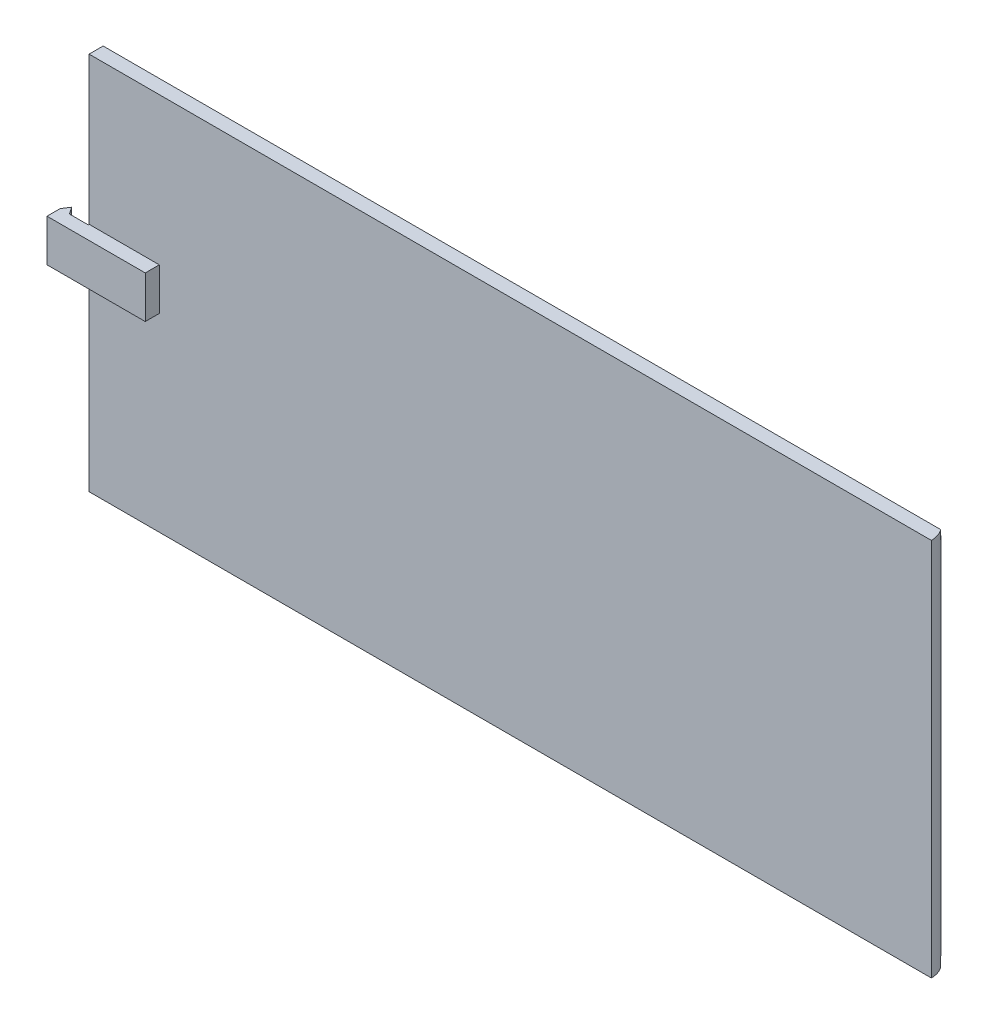
ISO-10303-21;
HEADER;
FILE_DESCRIPTION(('STEP AP214'),'2;1');
FILE_NAME('part.step','',(''),(''),'','','');
FILE_SCHEMA(('AUTOMOTIVE_DESIGN { 1 0 10303 214 1 1 1 1 }'));
ENDSEC;
DATA;
#1=APPLICATION_CONTEXT('core data for automotive mechanical design processes');
#2=APPLICATION_PROTOCOL_DEFINITION('international standard','automotive_design',2000,#1);
#3=PRODUCT_CONTEXT('',#1,'mechanical');
#4=PRODUCT('Part','Part','',(#3));
#5=PRODUCT_RELATED_PRODUCT_CATEGORY('part','',(#4));
#6=PRODUCT_DEFINITION_FORMATION('','',#4);
#7=PRODUCT_DEFINITION_CONTEXT('part definition',#1,'design');
#8=PRODUCT_DEFINITION('design','',#6,#7);
#9=PRODUCT_DEFINITION_SHAPE('','',#8);
#10=(LENGTH_UNIT() NAMED_UNIT(*) SI_UNIT(.MILLI.,.METRE.));
#11=(NAMED_UNIT(*) PLANE_ANGLE_UNIT() SI_UNIT($,.RADIAN.));
#12=(NAMED_UNIT(*) SI_UNIT($,.STERADIAN.) SOLID_ANGLE_UNIT());
#13=UNCERTAINTY_MEASURE_WITH_UNIT(LENGTH_MEASURE(1.E-05),#10,'distance_accuracy_value','');
#14=(GEOMETRIC_REPRESENTATION_CONTEXT(3) GLOBAL_UNCERTAINTY_ASSIGNED_CONTEXT((#13)) GLOBAL_UNIT_ASSIGNED_CONTEXT((#10,
#11,#12)) REPRESENTATION_CONTEXT('',''));
#15=CARTESIAN_POINT('',(0.,0.,0.));
#16=DIRECTION('',(0.,0.,1.));
#17=DIRECTION('',(1.,0.,0.));
#18=AXIS2_PLACEMENT_3D('',#15,#16,#17);
#19=CARTESIAN_POINT('',(-90.,-40.5,5.));
#20=DIRECTION('',(1.,0.,0.));
#21=DIRECTION('',(0.,0.,-1.));
#22=AXIS2_PLACEMENT_3D('',#19,#20,#21);
#23=PLANE('',#22);
#24=DIRECTION('',(0.,-1.,0.));
#25=VECTOR('',#24,1.);
#26=CARTESIAN_POINT('',(-90.,9.,5.2));
#27=LINE('',#26,#25);
#28=CARTESIAN_POINT('',(-90.,9.,5.2));
#29=VERTEX_POINT('',#28);
#30=CARTESIAN_POINT('',(-90.,0.,5.2));
#31=VERTEX_POINT('',#30);
#32=EDGE_CURVE('E289',#29,#31,#27,.T.);
#33=ORIENTED_EDGE('',*,*,#32,.F.);
#34=DIRECTION('',(0.,0.,-1.));
#35=VECTOR('',#34,1.);
#36=CARTESIAN_POINT('',(-90.,9.,8.));
#37=LINE('',#36,#35);
#38=CARTESIAN_POINT('',(-90.,9.,5.));
#39=VERTEX_POINT('',#38);
#40=EDGE_CURVE('E167',#29,#39,#37,.T.);
#41=ORIENTED_EDGE('',*,*,#40,.T.);
#42=DIRECTION('',(0.,-1.,0.));
#43=VECTOR('',#42,1.);
#44=CARTESIAN_POINT('',(-90.,-40.5,5.));
#45=LINE('',#44,#43);
#46=CARTESIAN_POINT('',(-90.,40.5,5.));
#47=VERTEX_POINT('',#46);
#48=EDGE_CURVE('E225',#47,#39,#45,.T.);
#49=ORIENTED_EDGE('',*,*,#48,.F.);
#50=DIRECTION('',(0.,0.,-1.));
#51=VECTOR('',#50,1.);
#52=CARTESIAN_POINT('',(-90.,40.5,5.));
#53=LINE('',#52,#51);
#54=CARTESIAN_POINT('',(-90.,40.5,2.));
#55=VERTEX_POINT('',#54);
#56=EDGE_CURVE('E235',#47,#55,#53,.T.);
#57=ORIENTED_EDGE('',*,*,#56,.T.);
#58=DIRECTION('',(0.,1.,0.));
#59=VECTOR('',#58,1.);
#60=CARTESIAN_POINT('',(-90.,40.5,2.));
#61=LINE('',#60,#59);
#62=CARTESIAN_POINT('',(-90.,38.5,2.));
#63=VERTEX_POINT('',#62);
#64=EDGE_CURVE('E198',#63,#55,#61,.T.);
#65=ORIENTED_EDGE('',*,*,#64,.F.);
#66=DIRECTION('',(0.,0.,1.));
#67=VECTOR('',#66,1.);
#68=CARTESIAN_POINT('',(-90.,38.5,0.));
#69=LINE('',#68,#67);
#70=CARTESIAN_POINT('',(-90.,38.5,0.));
#71=VERTEX_POINT('',#70);
#72=EDGE_CURVE('E195',#71,#63,#69,.T.);
#73=ORIENTED_EDGE('',*,*,#72,.F.);
#74=DIRECTION('',(0.,-1.,0.));
#75=VECTOR('',#74,1.);
#76=CARTESIAN_POINT('',(-90.,-40.5,0.));
#77=LINE('',#76,#75);
#78=CARTESIAN_POINT('',(-90.,-38.5,0.));
#79=VERTEX_POINT('',#78);
#80=EDGE_CURVE('E205',#71,#79,#77,.T.);
#81=ORIENTED_EDGE('',*,*,#80,.T.);
#82=DIRECTION('',(0.,0.,-1.));
#83=VECTOR('',#82,1.);
#84=CARTESIAN_POINT('',(-90.,-38.5,0.));
#85=LINE('',#84,#83);
#86=CARTESIAN_POINT('',(-90.,-38.5,2.));
#87=VERTEX_POINT('',#86);
#88=EDGE_CURVE('E211',#87,#79,#85,.T.);
#89=ORIENTED_EDGE('',*,*,#88,.F.);
#90=DIRECTION('',(0.,1.,0.));
#91=VECTOR('',#90,1.);
#92=CARTESIAN_POINT('',(-90.,-40.5,2.));
#93=LINE('',#92,#91);
#94=CARTESIAN_POINT('',(-90.,-40.5,2.));
#95=VERTEX_POINT('',#94);
#96=EDGE_CURVE('E194',#95,#87,#93,.T.);
#97=ORIENTED_EDGE('',*,*,#96,.F.);
#98=DIRECTION('',(0.,0.,-1.));
#99=VECTOR('',#98,1.);
#100=CARTESIAN_POINT('',(-90.,-40.5,5.));
#101=LINE('',#100,#99);
#102=CARTESIAN_POINT('',(-90.,-40.5,5.));
#103=VERTEX_POINT('',#102);
#104=EDGE_CURVE('E230',#103,#95,#101,.T.);
#105=ORIENTED_EDGE('',*,*,#104,.F.);
#106=CARTESIAN_POINT('',(-90.,0.,5.));
#107=VERTEX_POINT('',#106);
#108=EDGE_CURVE('E224',#107,#103,#45,.T.);
#109=ORIENTED_EDGE('',*,*,#108,.F.);
#110=DIRECTION('',(0.,0.,-1.));
#111=VECTOR('',#110,1.);
#112=CARTESIAN_POINT('',(-90.,0.,8.));
#113=LINE('',#112,#111);
#114=EDGE_CURVE('E192',#31,#107,#113,.T.);
#115=ORIENTED_EDGE('',*,*,#114,.F.);
#116=EDGE_LOOP('',(#33,#41,#49,#57,#65,#73,#81,#89,#97,#105,#109,#115));
#117=FACE_BOUND('',#116,.T.);
#118=ADVANCED_FACE('F34',(#117),#23,.F.);
#119=CARTESIAN_POINT('',(0.,0.,5.));
#120=DIRECTION('',(0.,0.,-1.));
#121=DIRECTION('',(-1.,0.,0.));
#122=AXIS2_PLACEMENT_3D('',#119,#120,#121);
#123=PLANE('',#122);
#124=DIRECTION('',(-1.,0.,0.));
#125=VECTOR('',#124,1.);
#126=CARTESIAN_POINT('',(-90.,9.,5.));
#127=LINE('',#126,#125);
#128=CARTESIAN_POINT('',(-75.,9.,5.));
#129=VERTEX_POINT('',#128);
#130=EDGE_CURVE('E57',#129,#39,#127,.T.);
#131=ORIENTED_EDGE('',*,*,#130,.F.);
#132=DIRECTION('',(0.,1.,0.));
#133=VECTOR('',#132,1.);
#134=CARTESIAN_POINT('',(-75.,0.,5.));
#135=LINE('',#134,#133);
#136=CARTESIAN_POINT('',(-75.,0.,5.));
#137=VERTEX_POINT('',#136);
#138=EDGE_CURVE('E171',#137,#129,#135,.T.);
#139=ORIENTED_EDGE('',*,*,#138,.F.);
#140=DIRECTION('',(1.,0.,0.));
#141=VECTOR('',#140,1.);
#142=CARTESIAN_POINT('',(-90.,0.,5.));
#143=LINE('',#142,#141);
#144=EDGE_CURVE('E168',#107,#137,#143,.T.);
#145=ORIENTED_EDGE('',*,*,#144,.F.);
#146=ORIENTED_EDGE('',*,*,#108,.T.);
#147=DIRECTION('',(1.,0.,0.));
#148=VECTOR('',#147,1.);
#149=CARTESIAN_POINT('',(-90.,-40.5,5.));
#150=LINE('',#149,#148);
#151=CARTESIAN_POINT('',(90.,-40.5,5.));
#152=VERTEX_POINT('',#151);
#153=EDGE_CURVE('E227',#103,#152,#150,.T.);
#154=ORIENTED_EDGE('',*,*,#153,.T.);
#155=DIRECTION('',(0.,1.,0.));
#156=VECTOR('',#155,1.);
#157=CARTESIAN_POINT('',(90.,-40.5,5.));
#158=LINE('',#157,#156);
#159=CARTESIAN_POINT('',(90.,40.5,5.));
#160=VERTEX_POINT('',#159);
#161=EDGE_CURVE('E219',#152,#160,#158,.T.);
#162=ORIENTED_EDGE('',*,*,#161,.T.);
#163=DIRECTION('',(-1.,0.,0.));
#164=VECTOR('',#163,1.);
#165=CARTESIAN_POINT('',(-90.,40.5,5.));
#166=LINE('',#165,#164);
#167=EDGE_CURVE('E222',#160,#47,#166,.T.);
#168=ORIENTED_EDGE('',*,*,#167,.T.);
#169=ORIENTED_EDGE('',*,*,#48,.T.);
#170=EDGE_LOOP('',(#131,#139,#145,#146,#154,#162,#168,#169));
#171=FACE_BOUND('',#170,.T.);
#172=ADVANCED_FACE('F278',(#171),#123,.F.);
#173=CARTESIAN_POINT('',(-90.,40.5,5.));
#174=DIRECTION('',(0.,-1.,0.));
#175=DIRECTION('',(0.,0.,-1.));
#176=AXIS2_PLACEMENT_3D('',#173,#174,#175);
#177=PLANE('',#176);
#178=CARTESIAN_POINT('',(85.,40.5,5.));
#179=DIRECTION('',(0.,-1.,0.));
#180=DIRECTION('',(0.,0.,-1.));
#181=AXIS2_PLACEMENT_3D('',#178,#179,#180);
#182=CIRCLE('',#181,5.);
#183=CARTESIAN_POINT('',(89.,40.5,2.));
#184=VERTEX_POINT('',#183);
#185=EDGE_CURVE('E238',#160,#184,#182,.F.);
#186=ORIENTED_EDGE('',*,*,#185,.T.);
#187=DIRECTION('',(-1.,0.,0.));
#188=VECTOR('',#187,1.);
#189=CARTESIAN_POINT('',(90.,40.5,2.));
#190=LINE('',#189,#188);
#191=EDGE_CURVE('E202',#184,#55,#190,.T.);
#192=ORIENTED_EDGE('',*,*,#191,.T.);
#193=ORIENTED_EDGE('',*,*,#56,.F.);
#194=ORIENTED_EDGE('',*,*,#167,.F.);
#195=EDGE_LOOP('',(#186,#192,#193,#194));
#196=FACE_BOUND('',#195,.T.);
#197=ADVANCED_FACE('F275',(#196),#177,.F.);
#198=CARTESIAN_POINT('',(-90.,-40.5,5.));
#199=DIRECTION('',(0.,1.,0.));
#200=DIRECTION('',(0.,0.,1.));
#201=AXIS2_PLACEMENT_3D('',#198,#199,#200);
#202=PLANE('',#201);
#203=ORIENTED_EDGE('',*,*,#104,.T.);
#204=DIRECTION('',(-1.,0.,0.));
#205=VECTOR('',#204,1.);
#206=CARTESIAN_POINT('',(90.,-40.5,2.));
#207=LINE('',#206,#205);
#208=CARTESIAN_POINT('',(89.,-40.5,2.));
#209=VERTEX_POINT('',#208);
#210=EDGE_CURVE('E213',#209,#95,#207,.T.);
#211=ORIENTED_EDGE('',*,*,#210,.F.);
#212=CARTESIAN_POINT('',(85.,-40.5,5.));
#213=DIRECTION('',(0.,1.,0.));
#214=DIRECTION('',(0.,0.,1.));
#215=AXIS2_PLACEMENT_3D('',#212,#213,#214);
#216=CIRCLE('',#215,5.);
#217=EDGE_CURVE('E244',#209,#152,#216,.F.);
#218=ORIENTED_EDGE('',*,*,#217,.T.);
#219=ORIENTED_EDGE('',*,*,#153,.F.);
#220=EDGE_LOOP('',(#203,#211,#218,#219));
#221=FACE_BOUND('',#220,.T.);
#222=ADVANCED_FACE('F284',(#221),#202,.F.);
#223=CARTESIAN_POINT('',(0.,0.,0.));
#224=DIRECTION('',(0.,0.,-1.));
#225=DIRECTION('',(-1.,0.,0.));
#226=AXIS2_PLACEMENT_3D('',#223,#224,#225);
#227=PLANE('',#226);
#228=DIRECTION('',(-1.,0.,0.));
#229=VECTOR('',#228,1.);
#230=CARTESIAN_POINT('',(90.,38.5,0.));
#231=LINE('',#230,#229);
#232=CARTESIAN_POINT('',(85.,38.5,0.));
#233=VERTEX_POINT('',#232);
#234=EDGE_CURVE('E201',#233,#71,#231,.T.);
#235=ORIENTED_EDGE('',*,*,#234,.F.);
#236=DIRECTION('',(0.,1.,0.));
#237=VECTOR('',#236,1.);
#238=CARTESIAN_POINT('',(85.,-40.5,0.));
#239=LINE('',#238,#237);
#240=CARTESIAN_POINT('',(85.,-38.5,0.));
#241=VERTEX_POINT('',#240);
#242=EDGE_CURVE('E241',#233,#241,#239,.F.);
#243=ORIENTED_EDGE('',*,*,#242,.T.);
#244=DIRECTION('',(-1.,0.,0.));
#245=VECTOR('',#244,1.);
#246=CARTESIAN_POINT('',(90.,-38.5,0.));
#247=LINE('',#246,#245);
#248=EDGE_CURVE('E199',#241,#79,#247,.T.);
#249=ORIENTED_EDGE('',*,*,#248,.T.);
#250=ORIENTED_EDGE('',*,*,#80,.F.);
#251=EDGE_LOOP('',(#235,#243,#249,#250));
#252=FACE_BOUND('',#251,.T.);
#253=ADVANCED_FACE('F260',(#252),#227,.T.);
#254=CARTESIAN_POINT('',(85.,-40.5,5.));
#255=DIRECTION('',(0.,-1.,0.));
#256=DIRECTION('',(0.,0.,-1.));
#257=AXIS2_PLACEMENT_3D('',#254,#255,#256);
#258=CYLINDRICAL_SURFACE('',#257,5.);
#259=DIRECTION('',(0.,-1.,0.));
#260=VECTOR('',#259,1.);
#261=CARTESIAN_POINT('',(89.,-40.5,2.00000000000004));
#262=LINE('',#261,#260);
#263=CARTESIAN_POINT('',(89.,38.5,2.));
#264=VERTEX_POINT('',#263);
#265=EDGE_CURVE('E11',#184,#264,#262,.T.);
#266=ORIENTED_EDGE('',*,*,#265,.F.);
#267=ORIENTED_EDGE('',*,*,#185,.F.);
#268=ORIENTED_EDGE('',*,*,#161,.F.);
#269=ORIENTED_EDGE('',*,*,#217,.F.);
#270=DIRECTION('',(0.,-1.,0.));
#271=VECTOR('',#270,1.);
#272=CARTESIAN_POINT('',(89.,-40.5,2.));
#273=LINE('',#272,#271);
#274=CARTESIAN_POINT('',(89.,-38.5,2.));
#275=VERTEX_POINT('',#274);
#276=EDGE_CURVE('E246',#275,#209,#273,.T.);
#277=ORIENTED_EDGE('',*,*,#276,.F.);
#278=CARTESIAN_POINT('',(85.,-38.5,5.));
#279=DIRECTION('',(0.,1.,0.));
#280=DIRECTION('',(0.,0.,1.));
#281=AXIS2_PLACEMENT_3D('',#278,#279,#280);
#282=CIRCLE('',#281,5.);
#283=EDGE_CURVE('E248',#241,#275,#282,.F.);
#284=ORIENTED_EDGE('',*,*,#283,.F.);
#285=ORIENTED_EDGE('',*,*,#242,.F.);
#286=CARTESIAN_POINT('',(85.,38.5,5.));
#287=DIRECTION('',(0.,-1.,0.));
#288=DIRECTION('',(0.,0.,-1.));
#289=AXIS2_PLACEMENT_3D('',#286,#287,#288);
#290=CIRCLE('',#289,5.);
#291=EDGE_CURVE('E42',#264,#233,#290,.F.);
#292=ORIENTED_EDGE('',*,*,#291,.F.);
#293=EDGE_LOOP('',(#266,#267,#268,#269,#277,#284,#285,#292));
#294=FACE_BOUND('',#293,.T.);
#295=ADVANCED_FACE('F36',(#294),#258,.T.);
#296=CARTESIAN_POINT('',(90.,-38.5,0.));
#297=DIRECTION('',(0.,1.,0.));
#298=DIRECTION('',(0.,0.,1.));
#299=AXIS2_PLACEMENT_3D('',#296,#297,#298);
#300=PLANE('',#299);
#301=ORIENTED_EDGE('',*,*,#283,.T.);
#302=DIRECTION('',(-1.,0.,0.));
#303=VECTOR('',#302,1.);
#304=CARTESIAN_POINT('',(90.,-38.5,2.));
#305=LINE('',#304,#303);
#306=EDGE_CURVE('E216',#275,#87,#305,.T.);
#307=ORIENTED_EDGE('',*,*,#306,.T.);
#308=ORIENTED_EDGE('',*,*,#88,.T.);
#309=ORIENTED_EDGE('',*,*,#248,.F.);
#310=EDGE_LOOP('',(#301,#307,#308,#309));
#311=FACE_BOUND('',#310,.T.);
#312=ADVANCED_FACE('F265',(#311),#300,.F.);
#313=CARTESIAN_POINT('',(90.,-40.5,2.));
#314=DIRECTION('',(0.,0.,1.));
#315=DIRECTION('',(1.,0.,0.));
#316=AXIS2_PLACEMENT_3D('',#313,#314,#315);
#317=PLANE('',#316);
#318=ORIENTED_EDGE('',*,*,#276,.T.);
#319=ORIENTED_EDGE('',*,*,#210,.T.);
#320=ORIENTED_EDGE('',*,*,#96,.T.);
#321=ORIENTED_EDGE('',*,*,#306,.F.);
#322=EDGE_LOOP('',(#318,#319,#320,#321));
#323=FACE_BOUND('',#322,.T.);
#324=ADVANCED_FACE('F287',(#323),#317,.F.);
#325=CARTESIAN_POINT('',(90.,40.5,2.));
#326=DIRECTION('',(0.,0.,1.));
#327=DIRECTION('',(0.,-1.,0.));
#328=AXIS2_PLACEMENT_3D('',#325,#326,#327);
#329=PLANE('',#328);
#330=ORIENTED_EDGE('',*,*,#265,.T.);
#331=DIRECTION('',(-1.,0.,0.));
#332=VECTOR('',#331,1.);
#333=CARTESIAN_POINT('',(90.,38.5,2.));
#334=LINE('',#333,#332);
#335=EDGE_CURVE('E206',#264,#63,#334,.T.);
#336=ORIENTED_EDGE('',*,*,#335,.T.);
#337=ORIENTED_EDGE('',*,*,#64,.T.);
#338=ORIENTED_EDGE('',*,*,#191,.F.);
#339=EDGE_LOOP('',(#330,#336,#337,#338));
#340=FACE_BOUND('',#339,.T.);
#341=ADVANCED_FACE('F273',(#340),#329,.F.);
#342=CARTESIAN_POINT('',(90.,38.5,0.));
#343=DIRECTION('',(0.,-1.,0.));
#344=DIRECTION('',(0.,0.,-1.));
#345=AXIS2_PLACEMENT_3D('',#342,#343,#344);
#346=PLANE('',#345);
#347=ORIENTED_EDGE('',*,*,#291,.T.);
#348=ORIENTED_EDGE('',*,*,#234,.T.);
#349=ORIENTED_EDGE('',*,*,#72,.T.);
#350=ORIENTED_EDGE('',*,*,#335,.F.);
#351=EDGE_LOOP('',(#347,#348,#349,#350));
#352=FACE_BOUND('',#351,.T.);
#353=ADVANCED_FACE('F253',(#352),#346,.F.);
#354=CARTESIAN_POINT('',(-90.,0.,8.));
#355=DIRECTION('',(0.,1.,0.));
#356=DIRECTION('',(0.,0.,1.));
#357=AXIS2_PLACEMENT_3D('',#354,#355,#356);
#358=PLANE('',#357);
#359=ORIENTED_EDGE('',*,*,#144,.T.);
#360=DIRECTION('',(0.,0.,-1.));
#361=VECTOR('',#360,1.);
#362=CARTESIAN_POINT('',(-75.,0.,8.));
#363=LINE('',#362,#361);
#364=CARTESIAN_POINT('',(-75.,0.,8.));
#365=VERTEX_POINT('',#364);
#366=EDGE_CURVE('E189',#365,#137,#363,.T.);
#367=ORIENTED_EDGE('',*,*,#366,.F.);
#368=DIRECTION('',(1.,0.,0.));
#369=VECTOR('',#368,1.);
#370=CARTESIAN_POINT('',(-90.,0.,8.));
#371=LINE('',#370,#369);
#372=CARTESIAN_POINT('',(-96.,0.,8.));
#373=VERTEX_POINT('',#372);
#374=EDGE_CURVE('E177',#373,#365,#371,.T.);
#375=ORIENTED_EDGE('',*,*,#374,.F.);
#376=DIRECTION('',(0.,0.,1.));
#377=VECTOR('',#376,1.);
#378=CARTESIAN_POINT('',(-96.,0.,8.));
#379=LINE('',#378,#377);
#380=CARTESIAN_POINT('',(-96.,0.,5.2));
#381=VERTEX_POINT('',#380);
#382=EDGE_CURVE('E173',#381,#373,#379,.T.);
#383=ORIENTED_EDGE('',*,*,#382,.F.);
#384=DIRECTION('',(0.542623968333368,0.,-0.839975731191175));
#385=VECTOR('',#384,1.);
#386=CARTESIAN_POINT('',(-96.,0.,5.2));
#387=LINE('',#386,#385);
#388=CARTESIAN_POINT('',(-95.0310006321899,0.,3.7));
#389=VERTEX_POINT('',#388);
#390=EDGE_CURVE('E296',#381,#389,#387,.T.);
#391=ORIENTED_EDGE('',*,*,#390,.T.);
#392=DIRECTION('',(0.566435787619025,0.,0.824105878212512));
#393=VECTOR('',#392,1.);
#394=CARTESIAN_POINT('',(-95.0310006321899,0.,3.7));
#395=LINE('',#394,#393);
#396=CARTESIAN_POINT('',(-94.,0.,5.2));
#397=VERTEX_POINT('',#396);
#398=EDGE_CURVE('E292',#389,#397,#395,.T.);
#399=ORIENTED_EDGE('',*,*,#398,.T.);
#400=DIRECTION('',(1.,0.,0.));
#401=VECTOR('',#400,1.);
#402=CARTESIAN_POINT('',(-96.,0.,5.2));
#403=LINE('',#402,#401);
#404=EDGE_CURVE('E163',#397,#31,#403,.T.);
#405=ORIENTED_EDGE('',*,*,#404,.T.);
#406=ORIENTED_EDGE('',*,*,#114,.T.);
#407=EDGE_LOOP('',(#359,#367,#375,#383,#391,#399,#405,#406));
#408=FACE_BOUND('',#407,.T.);
#409=ADVANCED_FACE('F309',(#408),#358,.F.);
#410=CARTESIAN_POINT('',(-75.,0.,8.));
#411=DIRECTION('',(-1.,0.,0.));
#412=DIRECTION('',(0.,0.,1.));
#413=AXIS2_PLACEMENT_3D('',#410,#411,#412);
#414=PLANE('',#413);
#415=ORIENTED_EDGE('',*,*,#138,.T.);
#416=DIRECTION('',(0.,0.,-1.));
#417=VECTOR('',#416,1.);
#418=CARTESIAN_POINT('',(-75.,9.,8.));
#419=LINE('',#418,#417);
#420=CARTESIAN_POINT('',(-75.,9.,8.));
#421=VERTEX_POINT('',#420);
#422=EDGE_CURVE('E186',#421,#129,#419,.T.);
#423=ORIENTED_EDGE('',*,*,#422,.F.);
#424=DIRECTION('',(0.,1.,0.));
#425=VECTOR('',#424,1.);
#426=CARTESIAN_POINT('',(-75.,0.,8.));
#427=LINE('',#426,#425);
#428=EDGE_CURVE('E179',#365,#421,#427,.T.);
#429=ORIENTED_EDGE('',*,*,#428,.F.);
#430=ORIENTED_EDGE('',*,*,#366,.T.);
#431=EDGE_LOOP('',(#415,#423,#429,#430));
#432=FACE_BOUND('',#431,.T.);
#433=ADVANCED_FACE('F323',(#432),#414,.F.);
#434=CARTESIAN_POINT('',(-90.,9.,8.));
#435=DIRECTION('',(0.,-1.,0.));
#436=DIRECTION('',(0.,0.,-1.));
#437=AXIS2_PLACEMENT_3D('',#434,#435,#436);
#438=PLANE('',#437);
#439=ORIENTED_EDGE('',*,*,#130,.T.);
#440=ORIENTED_EDGE('',*,*,#40,.F.);
#441=DIRECTION('',(1.,0.,0.));
#442=VECTOR('',#441,1.);
#443=CARTESIAN_POINT('',(-96.,9.,5.2));
#444=LINE('',#443,#442);
#445=CARTESIAN_POINT('',(-94.,9.,5.2));
#446=VERTEX_POINT('',#445);
#447=EDGE_CURVE('E49',#446,#29,#444,.T.);
#448=ORIENTED_EDGE('',*,*,#447,.F.);
#449=DIRECTION('',(-0.566435787619025,0.,-0.824105878212512));
#450=VECTOR('',#449,1.);
#451=CARTESIAN_POINT('',(-95.0310006321899,9.,3.7));
#452=LINE('',#451,#450);
#453=CARTESIAN_POINT('',(-95.0310006321899,9.,3.7));
#454=VERTEX_POINT('',#453);
#455=EDGE_CURVE('E150',#446,#454,#452,.T.);
#456=ORIENTED_EDGE('',*,*,#455,.T.);
#457=DIRECTION('',(-0.542623968333368,0.,0.839975731191175));
#458=VECTOR('',#457,1.);
#459=CARTESIAN_POINT('',(-96.,9.,5.2));
#460=LINE('',#459,#458);
#461=CARTESIAN_POINT('',(-96.,9.,5.2));
#462=VERTEX_POINT('',#461);
#463=EDGE_CURVE('E160',#454,#462,#460,.T.);
#464=ORIENTED_EDGE('',*,*,#463,.T.);
#465=DIRECTION('',(0.,0.,-1.));
#466=VECTOR('',#465,1.);
#467=CARTESIAN_POINT('',(-96.,9.,8.));
#468=LINE('',#467,#466);
#469=CARTESIAN_POINT('',(-96.,9.,8.));
#470=VERTEX_POINT('',#469);
#471=EDGE_CURVE('E294',#470,#462,#468,.T.);
#472=ORIENTED_EDGE('',*,*,#471,.F.);
#473=DIRECTION('',(-1.,0.,0.));
#474=VECTOR('',#473,1.);
#475=CARTESIAN_POINT('',(-90.,9.,8.));
#476=LINE('',#475,#474);
#477=EDGE_CURVE('E181',#421,#470,#476,.T.);
#478=ORIENTED_EDGE('',*,*,#477,.F.);
#479=ORIENTED_EDGE('',*,*,#422,.T.);
#480=EDGE_LOOP('',(#439,#440,#448,#456,#464,#472,#478,#479));
#481=FACE_BOUND('',#480,.T.);
#482=ADVANCED_FACE('F166',(#481),#438,.F.);
#483=CARTESIAN_POINT('',(0.,0.,8.));
#484=DIRECTION('',(0.,0.,-1.));
#485=DIRECTION('',(-1.,0.,0.));
#486=AXIS2_PLACEMENT_3D('',#483,#484,#485);
#487=PLANE('',#486);
#488=ORIENTED_EDGE('',*,*,#477,.T.);
#489=DIRECTION('',(0.,1.,0.));
#490=VECTOR('',#489,1.);
#491=CARTESIAN_POINT('',(-96.,9.,8.));
#492=LINE('',#491,#490);
#493=EDGE_CURVE('E291',#373,#470,#492,.T.);
#494=ORIENTED_EDGE('',*,*,#493,.F.);
#495=ORIENTED_EDGE('',*,*,#374,.T.);
#496=ORIENTED_EDGE('',*,*,#428,.T.);
#497=EDGE_LOOP('',(#488,#494,#495,#496));
#498=FACE_BOUND('',#497,.T.);
#499=ADVANCED_FACE('F318',(#498),#487,.F.);
#500=CARTESIAN_POINT('',(-96.,9.,5.2));
#501=DIRECTION('',(0.,0.,1.));
#502=DIRECTION('',(0.,-1.,0.));
#503=AXIS2_PLACEMENT_3D('',#500,#501,#502);
#504=PLANE('',#503);
#505=ORIENTED_EDGE('',*,*,#404,.F.);
#506=DIRECTION('',(0.,1.,0.));
#507=VECTOR('',#506,1.);
#508=CARTESIAN_POINT('',(-94.,-2.5,5.2));
#509=LINE('',#508,#507);
#510=EDGE_CURVE('E153',#397,#446,#509,.T.);
#511=ORIENTED_EDGE('',*,*,#510,.T.);
#512=ORIENTED_EDGE('',*,*,#447,.T.);
#513=ORIENTED_EDGE('',*,*,#32,.T.);
#514=EDGE_LOOP('',(#505,#511,#512,#513));
#515=FACE_BOUND('',#514,.T.);
#516=ADVANCED_FACE('F162',(#515),#504,.F.);
#517=CARTESIAN_POINT('',(-96.,0.,0.));
#518=DIRECTION('',(1.,0.,0.));
#519=DIRECTION('',(0.,0.,-1.));
#520=AXIS2_PLACEMENT_3D('',#517,#518,#519);
#521=PLANE('',#520);
#522=ORIENTED_EDGE('',*,*,#493,.T.);
#523=ORIENTED_EDGE('',*,*,#471,.T.);
#524=DIRECTION('',(0.,-1.,0.));
#525=VECTOR('',#524,1.);
#526=CARTESIAN_POINT('',(-96.,9.,5.2));
#527=LINE('',#526,#525);
#528=EDGE_CURVE('E301',#462,#381,#527,.T.);
#529=ORIENTED_EDGE('',*,*,#528,.T.);
#530=ORIENTED_EDGE('',*,*,#382,.T.);
#531=EDGE_LOOP('',(#522,#523,#529,#530));
#532=FACE_BOUND('',#531,.T.);
#533=ADVANCED_FACE('F315',(#532),#521,.F.);
#534=CARTESIAN_POINT('',(-96.,-2.5,5.2));
#535=DIRECTION('',(-0.839975731191175,0.,-0.542623968333368));
#536=DIRECTION('',(-0.542623968333368,0.,0.839975731191175));
#537=AXIS2_PLACEMENT_3D('',#534,#535,#536);
#538=PLANE('',#537);
#539=ORIENTED_EDGE('',*,*,#390,.F.);
#540=ORIENTED_EDGE('',*,*,#528,.F.);
#541=ORIENTED_EDGE('',*,*,#463,.F.);
#542=DIRECTION('',(0.,1.,0.));
#543=VECTOR('',#542,1.);
#544=CARTESIAN_POINT('',(-95.0310006321899,-2.5,3.7));
#545=LINE('',#544,#543);
#546=EDGE_CURVE('E156',#389,#454,#545,.T.);
#547=ORIENTED_EDGE('',*,*,#546,.F.);
#548=EDGE_LOOP('',(#539,#540,#541,#547));
#549=FACE_BOUND('',#548,.T.);
#550=ADVANCED_FACE('F311',(#549),#538,.T.);
#551=CARTESIAN_POINT('',(-95.0310006321899,-2.5,3.7));
#552=DIRECTION('',(0.824105878212512,0.,-0.566435787619025));
#553=DIRECTION('',(-0.566435787619025,0.,-0.824105878212512));
#554=AXIS2_PLACEMENT_3D('',#551,#552,#553);
#555=PLANE('',#554);
#556=ORIENTED_EDGE('',*,*,#398,.F.);
#557=ORIENTED_EDGE('',*,*,#546,.T.);
#558=ORIENTED_EDGE('',*,*,#455,.F.);
#559=ORIENTED_EDGE('',*,*,#510,.F.);
#560=EDGE_LOOP('',(#556,#557,#558,#559));
#561=FACE_BOUND('',#560,.T.);
#562=ADVANCED_FACE('F152',(#561),#555,.T.);
#563=CLOSED_SHELL('',(#118,#172,#197,#222,#253,#295,#312,#324,#341,#353,#409,#433,#482,#499,
#516,#533,#550,#562));
#564=MANIFOLD_SOLID_BREP('B2',#563);
#565=ADVANCED_BREP_SHAPE_REPRESENTATION('',(#18,#564),#14);
#566=SHAPE_DEFINITION_REPRESENTATION(#9,#565);
ENDSEC;
END-ISO-10303-21;
